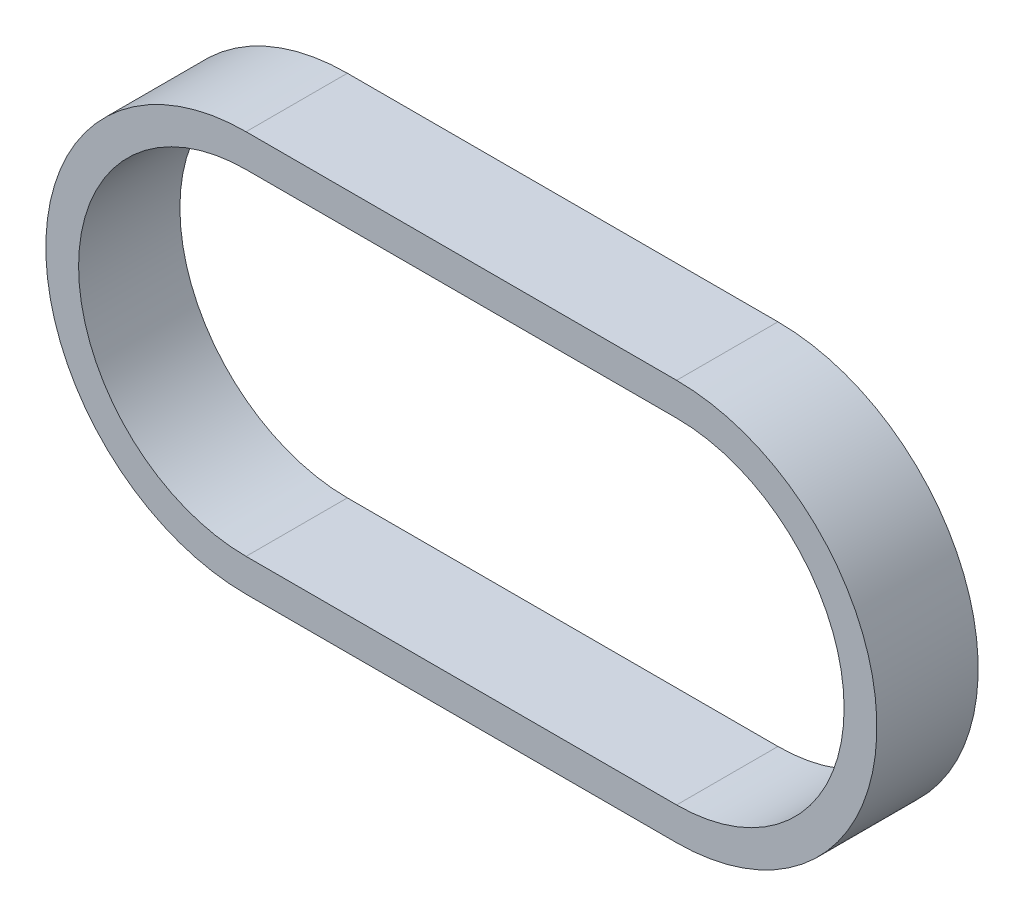
ISO-10303-21;
HEADER;
FILE_DESCRIPTION(('STEP AP214'),'2;1');
FILE_NAME('part.step','',(''),(''),'','','');
FILE_SCHEMA(('AUTOMOTIVE_DESIGN { 1 0 10303 214 1 1 1 1 }'));
ENDSEC;
DATA;
#1=APPLICATION_CONTEXT('core data for automotive mechanical design processes');
#2=APPLICATION_PROTOCOL_DEFINITION('international standard','automotive_design',2000,#1);
#3=PRODUCT_CONTEXT('',#1,'mechanical');
#4=PRODUCT('Part','Part','',(#3));
#5=PRODUCT_RELATED_PRODUCT_CATEGORY('part','',(#4));
#6=PRODUCT_DEFINITION_FORMATION('','',#4);
#7=PRODUCT_DEFINITION_CONTEXT('part definition',#1,'design');
#8=PRODUCT_DEFINITION('design','',#6,#7);
#9=PRODUCT_DEFINITION_SHAPE('','',#8);
#10=(LENGTH_UNIT() NAMED_UNIT(*) SI_UNIT(.MILLI.,.METRE.));
#11=(NAMED_UNIT(*) PLANE_ANGLE_UNIT() SI_UNIT($,.RADIAN.));
#12=(NAMED_UNIT(*) SI_UNIT($,.STERADIAN.) SOLID_ANGLE_UNIT());
#13=UNCERTAINTY_MEASURE_WITH_UNIT(LENGTH_MEASURE(1.E-05),#10,'distance_accuracy_value','');
#14=(GEOMETRIC_REPRESENTATION_CONTEXT(3) GLOBAL_UNCERTAINTY_ASSIGNED_CONTEXT((#13)) GLOBAL_UNIT_ASSIGNED_CONTEXT((#10,
#11,#12)) REPRESENTATION_CONTEXT('',''));
#15=CARTESIAN_POINT('',(0.,0.,0.));
#16=DIRECTION('',(0.,0.,1.));
#17=DIRECTION('',(1.,0.,0.));
#18=AXIS2_PLACEMENT_3D('',#15,#16,#17);
#19=CARTESIAN_POINT('',(0.,0.,3.));
#20=DIRECTION('',(0.,0.,-1.));
#21=DIRECTION('',(-1.,0.,0.));
#22=AXIS2_PLACEMENT_3D('',#19,#20,#21);
#23=CYLINDRICAL_SURFACE('',#22,9.91999999999999);
#24=CARTESIAN_POINT('',(0.,0.,-3.));
#25=DIRECTION('',(0.,0.,1.));
#26=DIRECTION('',(1.,0.,0.));
#27=AXIS2_PLACEMENT_3D('',#24,#25,#26);
#28=CIRCLE('',#27,9.91999999999999);
#29=CARTESIAN_POINT('',(0.,9.91999999999999,-3.));
#30=VERTEX_POINT('',#29);
#31=CARTESIAN_POINT('',(0.,-9.91999999999999,-3.));
#32=VERTEX_POINT('',#31);
#33=EDGE_CURVE('E144',#30,#32,#28,.T.);
#34=ORIENTED_EDGE('',*,*,#33,.F.);
#35=DIRECTION('',(0.,0.,-1.));
#36=VECTOR('',#35,1.);
#37=CARTESIAN_POINT('',(0.,9.91999999999999,3.));
#38=LINE('',#37,#36);
#39=CARTESIAN_POINT('',(0.,9.91999999999999,3.));
#40=VERTEX_POINT('',#39);
#41=EDGE_CURVE('E11',#40,#30,#38,.T.);
#42=ORIENTED_EDGE('',*,*,#41,.F.);
#43=CARTESIAN_POINT('',(0.,0.,3.));
#44=DIRECTION('',(0.,0.,1.));
#45=DIRECTION('',(1.,0.,0.));
#46=AXIS2_PLACEMENT_3D('',#43,#44,#45);
#47=CIRCLE('',#46,9.91999999999999);
#48=CARTESIAN_POINT('',(0.,-9.91999999999999,3.));
#49=VERTEX_POINT('',#48);
#50=EDGE_CURVE('E117',#40,#49,#47,.T.);
#51=ORIENTED_EDGE('',*,*,#50,.T.);
#52=DIRECTION('',(0.,0.,-1.));
#53=VECTOR('',#52,1.);
#54=CARTESIAN_POINT('',(0.,-9.91999999999999,3.));
#55=LINE('',#54,#53);
#56=EDGE_CURVE('E57',#49,#32,#55,.T.);
#57=ORIENTED_EDGE('',*,*,#56,.T.);
#58=EDGE_LOOP('',(#34,#42,#51,#57));
#59=FACE_BOUND('',#58,.T.);
#60=ADVANCED_FACE('F38',(#59),#23,.F.);
#61=CARTESIAN_POINT('',(0.,9.91999999999999,3.));
#62=DIRECTION('',(0.,1.,0.));
#63=DIRECTION('',(-1.,0.,0.));
#64=AXIS2_PLACEMENT_3D('',#61,#62,#63);
#65=PLANE('',#64);
#66=DIRECTION('',(1.,0.,0.));
#67=VECTOR('',#66,1.);
#68=CARTESIAN_POINT('',(0.,9.91999999999999,-3.));
#69=LINE('',#68,#67);
#70=CARTESIAN_POINT('',(25.5,9.92,-3.));
#71=VERTEX_POINT('',#70);
#72=EDGE_CURVE('E123',#30,#71,#69,.T.);
#73=ORIENTED_EDGE('',*,*,#72,.T.);
#74=DIRECTION('',(0.,0.,-1.));
#75=VECTOR('',#74,1.);
#76=CARTESIAN_POINT('',(25.5,9.92,3.));
#77=LINE('',#76,#75);
#78=CARTESIAN_POINT('',(25.5,9.92,3.));
#79=VERTEX_POINT('',#78);
#80=EDGE_CURVE('E48',#79,#71,#77,.T.);
#81=ORIENTED_EDGE('',*,*,#80,.F.);
#82=DIRECTION('',(1.,0.,0.));
#83=VECTOR('',#82,1.);
#84=CARTESIAN_POINT('',(0.,9.91999999999999,3.));
#85=LINE('',#84,#83);
#86=EDGE_CURVE('E111',#40,#79,#85,.T.);
#87=ORIENTED_EDGE('',*,*,#86,.F.);
#88=ORIENTED_EDGE('',*,*,#41,.T.);
#89=EDGE_LOOP('',(#73,#81,#87,#88));
#90=FACE_BOUND('',#89,.T.);
#91=ADVANCED_FACE('F121',(#90),#65,.F.);
#92=CARTESIAN_POINT('',(25.5,0.,3.));
#93=DIRECTION('',(0.,0.,-1.));
#94=DIRECTION('',(-1.,0.,0.));
#95=AXIS2_PLACEMENT_3D('',#92,#93,#94);
#96=CYLINDRICAL_SURFACE('',#95,9.92);
#97=CARTESIAN_POINT('',(25.5,0.,-3.));
#98=DIRECTION('',(0.,0.,1.));
#99=DIRECTION('',(1.,0.,0.));
#100=AXIS2_PLACEMENT_3D('',#97,#98,#99);
#101=CIRCLE('',#100,9.92);
#102=CARTESIAN_POINT('',(25.5,-9.92,-3.));
#103=VERTEX_POINT('',#102);
#104=EDGE_CURVE('E147',#103,#71,#101,.T.);
#105=ORIENTED_EDGE('',*,*,#104,.F.);
#106=DIRECTION('',(0.,0.,-1.));
#107=VECTOR('',#106,1.);
#108=CARTESIAN_POINT('',(25.5,-9.92,3.));
#109=LINE('',#108,#107);
#110=CARTESIAN_POINT('',(25.5,-9.92,3.));
#111=VERTEX_POINT('',#110);
#112=EDGE_CURVE('E82',#111,#103,#109,.T.);
#113=ORIENTED_EDGE('',*,*,#112,.F.);
#114=CARTESIAN_POINT('',(25.5,0.,3.));
#115=DIRECTION('',(0.,0.,1.));
#116=DIRECTION('',(1.,0.,0.));
#117=AXIS2_PLACEMENT_3D('',#114,#115,#116);
#118=CIRCLE('',#117,9.92);
#119=EDGE_CURVE('E116',#111,#79,#118,.T.);
#120=ORIENTED_EDGE('',*,*,#119,.T.);
#121=ORIENTED_EDGE('',*,*,#80,.T.);
#122=EDGE_LOOP('',(#105,#113,#120,#121));
#123=FACE_BOUND('',#122,.T.);
#124=ADVANCED_FACE('F127',(#123),#96,.F.);
#125=CARTESIAN_POINT('',(0.,11.86,3.));
#126=DIRECTION('',(0.,1.,0.));
#127=DIRECTION('',(-1.,0.,0.));
#128=AXIS2_PLACEMENT_3D('',#125,#126,#127);
#129=PLANE('',#128);
#130=DIRECTION('',(1.,0.,0.));
#131=VECTOR('',#130,1.);
#132=CARTESIAN_POINT('',(0.,11.86,-3.));
#133=LINE('',#132,#131);
#134=CARTESIAN_POINT('',(0.,11.86,-3.));
#135=VERTEX_POINT('',#134);
#136=CARTESIAN_POINT('',(25.5,11.86,-3.));
#137=VERTEX_POINT('',#136);
#138=EDGE_CURVE('E134',#135,#137,#133,.T.);
#139=ORIENTED_EDGE('',*,*,#138,.F.);
#140=DIRECTION('',(0.,0.,-1.));
#141=VECTOR('',#140,1.);
#142=CARTESIAN_POINT('',(0.,11.86,3.));
#143=LINE('',#142,#141);
#144=CARTESIAN_POINT('',(0.,11.86,3.));
#145=VERTEX_POINT('',#144);
#146=EDGE_CURVE('E42',#145,#135,#143,.T.);
#147=ORIENTED_EDGE('',*,*,#146,.F.);
#148=DIRECTION('',(1.,0.,0.));
#149=VECTOR('',#148,1.);
#150=CARTESIAN_POINT('',(0.,11.86,3.));
#151=LINE('',#150,#149);
#152=CARTESIAN_POINT('',(25.5,11.86,3.));
#153=VERTEX_POINT('',#152);
#154=EDGE_CURVE('E152',#145,#153,#151,.T.);
#155=ORIENTED_EDGE('',*,*,#154,.T.);
#156=DIRECTION('',(0.,0.,-1.));
#157=VECTOR('',#156,1.);
#158=CARTESIAN_POINT('',(25.5,11.86,3.));
#159=LINE('',#158,#157);
#160=EDGE_CURVE('E130',#153,#137,#159,.T.);
#161=ORIENTED_EDGE('',*,*,#160,.T.);
#162=EDGE_LOOP('',(#139,#147,#155,#161));
#163=FACE_BOUND('',#162,.T.);
#164=ADVANCED_FACE('F40',(#163),#129,.T.);
#165=CARTESIAN_POINT('',(0.,0.,3.));
#166=DIRECTION('',(0.,0.,-1.));
#167=DIRECTION('',(-1.,0.,0.));
#168=AXIS2_PLACEMENT_3D('',#165,#166,#167);
#169=CYLINDRICAL_SURFACE('',#168,11.86);
#170=CARTESIAN_POINT('',(0.,0.,-3.));
#171=DIRECTION('',(0.,0.,1.));
#172=DIRECTION('',(1.,0.,0.));
#173=AXIS2_PLACEMENT_3D('',#170,#171,#172);
#174=CIRCLE('',#173,11.86);
#175=CARTESIAN_POINT('',(0.,-11.86,-3.));
#176=VERTEX_POINT('',#175);
#177=EDGE_CURVE('E137',#135,#176,#174,.T.);
#178=ORIENTED_EDGE('',*,*,#177,.T.);
#179=DIRECTION('',(0.,0.,-1.));
#180=VECTOR('',#179,1.);
#181=CARTESIAN_POINT('',(0.,-11.86,3.));
#182=LINE('',#181,#180);
#183=CARTESIAN_POINT('',(0.,-11.86,3.));
#184=VERTEX_POINT('',#183);
#185=EDGE_CURVE('E158',#184,#176,#182,.T.);
#186=ORIENTED_EDGE('',*,*,#185,.F.);
#187=CARTESIAN_POINT('',(0.,0.,3.));
#188=DIRECTION('',(0.,0.,1.));
#189=DIRECTION('',(1.,0.,0.));
#190=AXIS2_PLACEMENT_3D('',#187,#188,#189);
#191=CIRCLE('',#190,11.86);
#192=EDGE_CURVE('E167',#145,#184,#191,.T.);
#193=ORIENTED_EDGE('',*,*,#192,.F.);
#194=ORIENTED_EDGE('',*,*,#146,.T.);
#195=EDGE_LOOP('',(#178,#186,#193,#194));
#196=FACE_BOUND('',#195,.T.);
#197=ADVANCED_FACE('F166',(#196),#169,.T.);
#198=CARTESIAN_POINT('',(0.,-11.86,3.));
#199=DIRECTION('',(0.,1.,0.));
#200=DIRECTION('',(-1.,0.,0.));
#201=AXIS2_PLACEMENT_3D('',#198,#199,#200);
#202=PLANE('',#201);
#203=DIRECTION('',(1.,0.,0.));
#204=VECTOR('',#203,1.);
#205=CARTESIAN_POINT('',(0.,-11.86,-3.));
#206=LINE('',#205,#204);
#207=CARTESIAN_POINT('',(25.5,-11.86,-3.));
#208=VERTEX_POINT('',#207);
#209=EDGE_CURVE('E139',#176,#208,#206,.T.);
#210=ORIENTED_EDGE('',*,*,#209,.T.);
#211=DIRECTION('',(0.,0.,-1.));
#212=VECTOR('',#211,1.);
#213=CARTESIAN_POINT('',(25.5,-11.86,3.));
#214=LINE('',#213,#212);
#215=CARTESIAN_POINT('',(25.5,-11.86,3.));
#216=VERTEX_POINT('',#215);
#217=EDGE_CURVE('E156',#216,#208,#214,.T.);
#218=ORIENTED_EDGE('',*,*,#217,.F.);
#219=DIRECTION('',(1.,0.,0.));
#220=VECTOR('',#219,1.);
#221=CARTESIAN_POINT('',(0.,-11.86,3.));
#222=LINE('',#221,#220);
#223=EDGE_CURVE('E180',#184,#216,#222,.T.);
#224=ORIENTED_EDGE('',*,*,#223,.F.);
#225=ORIENTED_EDGE('',*,*,#185,.T.);
#226=EDGE_LOOP('',(#210,#218,#224,#225));
#227=FACE_BOUND('',#226,.T.);
#228=ADVANCED_FACE('F179',(#227),#202,.F.);
#229=CARTESIAN_POINT('',(25.5,0.,3.));
#230=DIRECTION('',(0.,0.,-1.));
#231=DIRECTION('',(-1.,0.,0.));
#232=AXIS2_PLACEMENT_3D('',#229,#230,#231);
#233=CYLINDRICAL_SURFACE('',#232,11.86);
#234=CARTESIAN_POINT('',(25.5,0.,-3.));
#235=DIRECTION('',(0.,0.,1.));
#236=DIRECTION('',(1.,0.,0.));
#237=AXIS2_PLACEMENT_3D('',#234,#235,#236);
#238=CIRCLE('',#237,11.86);
#239=EDGE_CURVE('E141',#208,#137,#238,.T.);
#240=ORIENTED_EDGE('',*,*,#239,.T.);
#241=ORIENTED_EDGE('',*,*,#160,.F.);
#242=CARTESIAN_POINT('',(25.5,0.,3.));
#243=DIRECTION('',(0.,0.,1.));
#244=DIRECTION('',(1.,0.,0.));
#245=AXIS2_PLACEMENT_3D('',#242,#243,#244);
#246=CIRCLE('',#245,11.86);
#247=EDGE_CURVE('E178',#216,#153,#246,.T.);
#248=ORIENTED_EDGE('',*,*,#247,.F.);
#249=ORIENTED_EDGE('',*,*,#217,.T.);
#250=EDGE_LOOP('',(#240,#241,#248,#249));
#251=FACE_BOUND('',#250,.T.);
#252=ADVANCED_FACE('F176',(#251),#233,.T.);
#253=CARTESIAN_POINT('',(0.,-9.91999999999999,3.));
#254=DIRECTION('',(0.,1.,0.));
#255=DIRECTION('',(-1.,0.,0.));
#256=AXIS2_PLACEMENT_3D('',#253,#254,#255);
#257=PLANE('',#256);
#258=DIRECTION('',(1.,0.,0.));
#259=VECTOR('',#258,1.);
#260=CARTESIAN_POINT('',(0.,-9.91999999999999,-3.));
#261=LINE('',#260,#259);
#262=EDGE_CURVE('E149',#32,#103,#261,.T.);
#263=ORIENTED_EDGE('',*,*,#262,.F.);
#264=ORIENTED_EDGE('',*,*,#56,.F.);
#265=DIRECTION('',(1.,0.,0.));
#266=VECTOR('',#265,1.);
#267=CARTESIAN_POINT('',(0.,-9.91999999999999,3.));
#268=LINE('',#267,#266);
#269=EDGE_CURVE('E128',#49,#111,#268,.T.);
#270=ORIENTED_EDGE('',*,*,#269,.T.);
#271=ORIENTED_EDGE('',*,*,#112,.T.);
#272=EDGE_LOOP('',(#263,#264,#270,#271));
#273=FACE_BOUND('',#272,.T.);
#274=ADVANCED_FACE('F186',(#273),#257,.T.);
#275=CARTESIAN_POINT('',(0.,0.,3.));
#276=DIRECTION('',(0.,0.,1.));
#277=DIRECTION('',(1.,0.,0.));
#278=AXIS2_PLACEMENT_3D('',#275,#276,#277);
#279=PLANE('',#278);
#280=ORIENTED_EDGE('',*,*,#154,.F.);
#281=ORIENTED_EDGE('',*,*,#192,.T.);
#282=ORIENTED_EDGE('',*,*,#223,.T.);
#283=ORIENTED_EDGE('',*,*,#247,.T.);
#284=EDGE_LOOP('',(#280,#281,#282,#283));
#285=FACE_BOUND('',#284,.T.);
#286=ORIENTED_EDGE('',*,*,#50,.F.);
#287=ORIENTED_EDGE('',*,*,#86,.T.);
#288=ORIENTED_EDGE('',*,*,#119,.F.);
#289=ORIENTED_EDGE('',*,*,#269,.F.);
#290=EDGE_LOOP('',(#286,#287,#288,#289));
#291=FACE_BOUND('',#290,.T.);
#292=ADVANCED_FACE('F113',(#285,#291),#279,.T.);
#293=CARTESIAN_POINT('',(0.,0.,-3.));
#294=DIRECTION('',(0.,0.,1.));
#295=DIRECTION('',(1.,0.,0.));
#296=AXIS2_PLACEMENT_3D('',#293,#294,#295);
#297=PLANE('',#296);
#298=ORIENTED_EDGE('',*,*,#138,.T.);
#299=ORIENTED_EDGE('',*,*,#239,.F.);
#300=ORIENTED_EDGE('',*,*,#209,.F.);
#301=ORIENTED_EDGE('',*,*,#177,.F.);
#302=EDGE_LOOP('',(#298,#299,#300,#301));
#303=FACE_BOUND('',#302,.T.);
#304=ORIENTED_EDGE('',*,*,#33,.T.);
#305=ORIENTED_EDGE('',*,*,#262,.T.);
#306=ORIENTED_EDGE('',*,*,#104,.T.);
#307=ORIENTED_EDGE('',*,*,#72,.F.);
#308=EDGE_LOOP('',(#304,#305,#306,#307));
#309=FACE_BOUND('',#308,.T.);
#310=ADVANCED_FACE('F170',(#303,#309),#297,.F.);
#311=CLOSED_SHELL('',(#60,#91,#124,#164,#197,#228,#252,#274,#292,#310));
#312=MANIFOLD_SOLID_BREP('B2',#311);
#313=ADVANCED_BREP_SHAPE_REPRESENTATION('',(#18,#312),#14);
#314=SHAPE_DEFINITION_REPRESENTATION(#9,#313);
ENDSEC;
END-ISO-10303-21;
